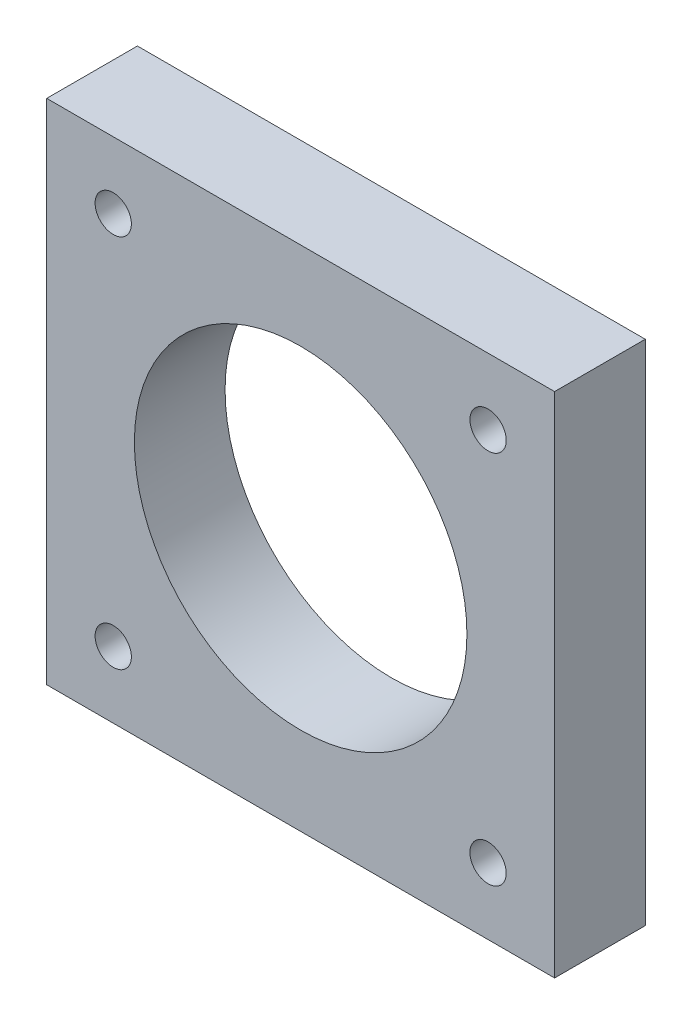
ISO-10303-21;
HEADER;
FILE_DESCRIPTION(('STEP AP214'),'2;1');
FILE_NAME('part.step','',(''),(''),'','','');
FILE_SCHEMA(('AUTOMOTIVE_DESIGN { 1 0 10303 214 1 1 1 1 }'));
ENDSEC;
DATA;
#1=APPLICATION_CONTEXT('core data for automotive mechanical design processes');
#2=APPLICATION_PROTOCOL_DEFINITION('international standard','automotive_design',2000,#1);
#3=PRODUCT_CONTEXT('',#1,'mechanical');
#4=PRODUCT('Part','Part','',(#3));
#5=PRODUCT_RELATED_PRODUCT_CATEGORY('part','',(#4));
#6=PRODUCT_DEFINITION_FORMATION('','',#4);
#7=PRODUCT_DEFINITION_CONTEXT('part definition',#1,'design');
#8=PRODUCT_DEFINITION('design','',#6,#7);
#9=PRODUCT_DEFINITION_SHAPE('','',#8);
#10=(LENGTH_UNIT() NAMED_UNIT(*) SI_UNIT(.MILLI.,.METRE.));
#11=(NAMED_UNIT(*) PLANE_ANGLE_UNIT() SI_UNIT($,.RADIAN.));
#12=(NAMED_UNIT(*) SI_UNIT($,.STERADIAN.) SOLID_ANGLE_UNIT());
#13=UNCERTAINTY_MEASURE_WITH_UNIT(LENGTH_MEASURE(1.E-05),#10,'distance_accuracy_value','');
#14=(GEOMETRIC_REPRESENTATION_CONTEXT(3) GLOBAL_UNCERTAINTY_ASSIGNED_CONTEXT((#13)) GLOBAL_UNIT_ASSIGNED_CONTEXT((#10,
#11,#12)) REPRESENTATION_CONTEXT('',''));
#15=CARTESIAN_POINT('',(0.,0.,0.));
#16=DIRECTION('',(0.,0.,1.));
#17=DIRECTION('',(1.,0.,0.));
#18=AXIS2_PLACEMENT_3D('',#15,#16,#17);
#19=CARTESIAN_POINT('',(0.,0.,7.5));
#20=DIRECTION('',(0.,0.,-1.));
#21=DIRECTION('',(-1.,0.,0.));
#22=AXIS2_PLACEMENT_3D('',#19,#20,#21);
#23=PLANE('',#22);
#24=CARTESIAN_POINT('',(5.5,36.5,7.5));
#25=DIRECTION('',(0.,0.,1.));
#26=DIRECTION('',(1.,0.,0.));
#27=AXIS2_PLACEMENT_3D('',#24,#25,#26);
#28=CIRCLE('',#27,1.5);
#29=CARTESIAN_POINT('',(7.,36.5,7.5));
#30=VERTEX_POINT('',#29);
#31=EDGE_CURVE('E129',#30,#30,#28,.T.);
#32=ORIENTED_EDGE('',*,*,#31,.F.);
#33=EDGE_LOOP('',(#32));
#34=FACE_BOUND('',#33,.T.);
#35=CARTESIAN_POINT('',(36.5,5.50000000000001,7.5));
#36=DIRECTION('',(0.,0.,1.));
#37=DIRECTION('',(1.,0.,0.));
#38=AXIS2_PLACEMENT_3D('',#35,#36,#37);
#39=CIRCLE('',#38,1.5);
#40=CARTESIAN_POINT('',(38.,5.50000000000001,7.5));
#41=VERTEX_POINT('',#40);
#42=EDGE_CURVE('E117',#41,#41,#39,.T.);
#43=ORIENTED_EDGE('',*,*,#42,.F.);
#44=EDGE_LOOP('',(#43));
#45=FACE_BOUND('',#44,.T.);
#46=DIRECTION('',(0.,-1.,0.));
#47=VECTOR('',#46,1.);
#48=CARTESIAN_POINT('',(0.,0.,7.5));
#49=LINE('',#48,#47);
#50=CARTESIAN_POINT('',(0.,42.,7.5));
#51=VERTEX_POINT('',#50);
#52=CARTESIAN_POINT('',(0.,0.,7.5));
#53=VERTEX_POINT('',#52);
#54=EDGE_CURVE('E87',#51,#53,#49,.T.);
#55=ORIENTED_EDGE('',*,*,#54,.T.);
#56=DIRECTION('',(1.,0.,0.));
#57=VECTOR('',#56,1.);
#58=CARTESIAN_POINT('',(0.,0.,7.5));
#59=LINE('',#58,#57);
#60=CARTESIAN_POINT('',(42.,0.,7.5));
#61=VERTEX_POINT('',#60);
#62=EDGE_CURVE('E82',#53,#61,#59,.T.);
#63=ORIENTED_EDGE('',*,*,#62,.T.);
#64=DIRECTION('',(0.,1.,0.));
#65=VECTOR('',#64,1.);
#66=CARTESIAN_POINT('',(42.,0.,7.5));
#67=LINE('',#66,#65);
#68=CARTESIAN_POINT('',(42.,42.,7.5));
#69=VERTEX_POINT('',#68);
#70=EDGE_CURVE('E85',#61,#69,#67,.T.);
#71=ORIENTED_EDGE('',*,*,#70,.T.);
#72=DIRECTION('',(-1.,0.,0.));
#73=VECTOR('',#72,1.);
#74=CARTESIAN_POINT('',(0.,42.,7.5));
#75=LINE('',#74,#73);
#76=EDGE_CURVE('E52',#69,#51,#75,.T.);
#77=ORIENTED_EDGE('',*,*,#76,.T.);
#78=EDGE_LOOP('',(#55,#63,#71,#77));
#79=FACE_BOUND('',#78,.T.);
#80=CARTESIAN_POINT('',(5.5,5.50000000000001,7.5));
#81=DIRECTION('',(0.,0.,1.));
#82=DIRECTION('',(1.,0.,0.));
#83=AXIS2_PLACEMENT_3D('',#80,#81,#82);
#84=CIRCLE('',#83,1.5);
#85=CARTESIAN_POINT('',(7.,5.50000000000001,7.5));
#86=VERTEX_POINT('',#85);
#87=EDGE_CURVE('E102',#86,#86,#84,.T.);
#88=ORIENTED_EDGE('',*,*,#87,.F.);
#89=EDGE_LOOP('',(#88));
#90=FACE_BOUND('',#89,.T.);
#91=CARTESIAN_POINT('',(36.5,36.5,7.5));
#92=DIRECTION('',(0.,0.,1.));
#93=DIRECTION('',(1.,0.,0.));
#94=AXIS2_PLACEMENT_3D('',#91,#92,#93);
#95=CIRCLE('',#94,1.5);
#96=CARTESIAN_POINT('',(38.,36.5,7.5));
#97=VERTEX_POINT('',#96);
#98=EDGE_CURVE('E123',#97,#97,#95,.T.);
#99=ORIENTED_EDGE('',*,*,#98,.F.);
#100=EDGE_LOOP('',(#99));
#101=FACE_BOUND('',#100,.T.);
#102=CARTESIAN_POINT('',(21.,21.,7.5));
#103=DIRECTION('',(0.,0.,1.));
#104=DIRECTION('',(1.,0.,0.));
#105=AXIS2_PLACEMENT_3D('',#102,#103,#104);
#106=CIRCLE('',#105,13.75);
#107=CARTESIAN_POINT('',(34.75,21.,7.5));
#108=VERTEX_POINT('',#107);
#109=EDGE_CURVE('E135',#108,#108,#106,.T.);
#110=ORIENTED_EDGE('',*,*,#109,.F.);
#111=EDGE_LOOP('',(#110));
#112=FACE_BOUND('',#111,.T.);
#113=ADVANCED_FACE('F35',(#34,#45,#79,#90,#101,#112),#23,.F.);
#114=CARTESIAN_POINT('',(0.,0.,0.));
#115=DIRECTION('',(0.,0.,-1.));
#116=DIRECTION('',(-1.,0.,0.));
#117=AXIS2_PLACEMENT_3D('',#114,#115,#116);
#118=PLANE('',#117);
#119=CARTESIAN_POINT('',(5.5,36.5,0.));
#120=DIRECTION('',(0.,0.,1.));
#121=DIRECTION('',(1.,0.,0.));
#122=AXIS2_PLACEMENT_3D('',#119,#120,#121);
#123=CIRCLE('',#122,1.5);
#124=CARTESIAN_POINT('',(7.,36.5,0.));
#125=VERTEX_POINT('',#124);
#126=EDGE_CURVE('E132',#125,#125,#123,.T.);
#127=ORIENTED_EDGE('',*,*,#126,.T.);
#128=EDGE_LOOP('',(#127));
#129=FACE_BOUND('',#128,.T.);
#130=CARTESIAN_POINT('',(36.5,5.50000000000001,0.));
#131=DIRECTION('',(0.,0.,1.));
#132=DIRECTION('',(1.,0.,0.));
#133=AXIS2_PLACEMENT_3D('',#130,#131,#132);
#134=CIRCLE('',#133,1.5);
#135=CARTESIAN_POINT('',(38.,5.50000000000001,0.));
#136=VERTEX_POINT('',#135);
#137=EDGE_CURVE('E120',#136,#136,#134,.T.);
#138=ORIENTED_EDGE('',*,*,#137,.T.);
#139=EDGE_LOOP('',(#138));
#140=FACE_BOUND('',#139,.T.);
#141=DIRECTION('',(0.,-1.,0.));
#142=VECTOR('',#141,1.);
#143=CARTESIAN_POINT('',(0.,0.,0.));
#144=LINE('',#143,#142);
#145=CARTESIAN_POINT('',(0.,42.,0.));
#146=VERTEX_POINT('',#145);
#147=CARTESIAN_POINT('',(0.,0.,0.));
#148=VERTEX_POINT('',#147);
#149=EDGE_CURVE('E99',#146,#148,#144,.T.);
#150=ORIENTED_EDGE('',*,*,#149,.F.);
#151=DIRECTION('',(-1.,0.,0.));
#152=VECTOR('',#151,1.);
#153=CARTESIAN_POINT('',(0.,42.,0.));
#154=LINE('',#153,#152);
#155=CARTESIAN_POINT('',(42.,42.,0.));
#156=VERTEX_POINT('',#155);
#157=EDGE_CURVE('E75',#156,#146,#154,.T.);
#158=ORIENTED_EDGE('',*,*,#157,.F.);
#159=DIRECTION('',(0.,1.,0.));
#160=VECTOR('',#159,1.);
#161=CARTESIAN_POINT('',(42.,0.,0.));
#162=LINE('',#161,#160);
#163=CARTESIAN_POINT('',(42.,0.,0.));
#164=VERTEX_POINT('',#163);
#165=EDGE_CURVE('E69',#164,#156,#162,.T.);
#166=ORIENTED_EDGE('',*,*,#165,.F.);
#167=DIRECTION('',(1.,0.,0.));
#168=VECTOR('',#167,1.);
#169=CARTESIAN_POINT('',(0.,0.,0.));
#170=LINE('',#169,#168);
#171=EDGE_CURVE('E91',#148,#164,#170,.T.);
#172=ORIENTED_EDGE('',*,*,#171,.F.);
#173=EDGE_LOOP('',(#150,#158,#166,#172));
#174=FACE_BOUND('',#173,.T.);
#175=CARTESIAN_POINT('',(5.5,5.50000000000001,0.));
#176=DIRECTION('',(0.,0.,1.));
#177=DIRECTION('',(1.,0.,0.));
#178=AXIS2_PLACEMENT_3D('',#175,#176,#177);
#179=CIRCLE('',#178,1.5);
#180=CARTESIAN_POINT('',(7.,5.50000000000001,0.));
#181=VERTEX_POINT('',#180);
#182=EDGE_CURVE('E114',#181,#181,#179,.T.);
#183=ORIENTED_EDGE('',*,*,#182,.T.);
#184=EDGE_LOOP('',(#183));
#185=FACE_BOUND('',#184,.T.);
#186=CARTESIAN_POINT('',(36.5,36.5,0.));
#187=DIRECTION('',(0.,0.,1.));
#188=DIRECTION('',(1.,0.,0.));
#189=AXIS2_PLACEMENT_3D('',#186,#187,#188);
#190=CIRCLE('',#189,1.5);
#191=CARTESIAN_POINT('',(38.,36.5,0.));
#192=VERTEX_POINT('',#191);
#193=EDGE_CURVE('E126',#192,#192,#190,.T.);
#194=ORIENTED_EDGE('',*,*,#193,.T.);
#195=EDGE_LOOP('',(#194));
#196=FACE_BOUND('',#195,.T.);
#197=CARTESIAN_POINT('',(21.,21.,0.));
#198=DIRECTION('',(0.,0.,1.));
#199=DIRECTION('',(1.,0.,0.));
#200=AXIS2_PLACEMENT_3D('',#197,#198,#199);
#201=CIRCLE('',#200,13.75);
#202=CARTESIAN_POINT('',(34.75,21.,0.));
#203=VERTEX_POINT('',#202);
#204=EDGE_CURVE('E138',#203,#203,#201,.T.);
#205=ORIENTED_EDGE('',*,*,#204,.T.);
#206=EDGE_LOOP('',(#205));
#207=FACE_BOUND('',#206,.T.);
#208=ADVANCED_FACE('F110',(#129,#140,#174,#185,#196,#207),#118,.T.);
#209=CARTESIAN_POINT('',(0.,0.,7.5));
#210=DIRECTION('',(1.,0.,0.));
#211=DIRECTION('',(0.,0.,-1.));
#212=AXIS2_PLACEMENT_3D('',#209,#210,#211);
#213=PLANE('',#212);
#214=ORIENTED_EDGE('',*,*,#149,.T.);
#215=DIRECTION('',(0.,0.,-1.));
#216=VECTOR('',#215,1.);
#217=CARTESIAN_POINT('',(0.,0.,7.5));
#218=LINE('',#217,#216);
#219=EDGE_CURVE('E11',#53,#148,#218,.T.);
#220=ORIENTED_EDGE('',*,*,#219,.F.);
#221=ORIENTED_EDGE('',*,*,#54,.F.);
#222=DIRECTION('',(0.,0.,-1.));
#223=VECTOR('',#222,1.);
#224=CARTESIAN_POINT('',(0.,42.,7.5));
#225=LINE('',#224,#223);
#226=EDGE_CURVE('E95',#51,#146,#225,.T.);
#227=ORIENTED_EDGE('',*,*,#226,.T.);
#228=EDGE_LOOP('',(#214,#220,#221,#227));
#229=FACE_BOUND('',#228,.T.);
#230=ADVANCED_FACE('F37',(#229),#213,.F.);
#231=CARTESIAN_POINT('',(0.,0.,7.5));
#232=DIRECTION('',(0.,1.,0.));
#233=DIRECTION('',(0.,0.,1.));
#234=AXIS2_PLACEMENT_3D('',#231,#232,#233);
#235=PLANE('',#234);
#236=ORIENTED_EDGE('',*,*,#171,.T.);
#237=DIRECTION('',(0.,0.,-1.));
#238=VECTOR('',#237,1.);
#239=CARTESIAN_POINT('',(42.,0.,7.5));
#240=LINE('',#239,#238);
#241=EDGE_CURVE('E44',#61,#164,#240,.T.);
#242=ORIENTED_EDGE('',*,*,#241,.F.);
#243=ORIENTED_EDGE('',*,*,#62,.F.);
#244=ORIENTED_EDGE('',*,*,#219,.T.);
#245=EDGE_LOOP('',(#236,#242,#243,#244));
#246=FACE_BOUND('',#245,.T.);
#247=ADVANCED_FACE('F90',(#246),#235,.F.);
#248=CARTESIAN_POINT('',(42.,0.,7.5));
#249=DIRECTION('',(-1.,0.,0.));
#250=DIRECTION('',(0.,0.,1.));
#251=AXIS2_PLACEMENT_3D('',#248,#249,#250);
#252=PLANE('',#251);
#253=ORIENTED_EDGE('',*,*,#165,.T.);
#254=DIRECTION('',(0.,0.,-1.));
#255=VECTOR('',#254,1.);
#256=CARTESIAN_POINT('',(42.,42.,7.5));
#257=LINE('',#256,#255);
#258=EDGE_CURVE('E92',#69,#156,#257,.T.);
#259=ORIENTED_EDGE('',*,*,#258,.F.);
#260=ORIENTED_EDGE('',*,*,#70,.F.);
#261=ORIENTED_EDGE('',*,*,#241,.T.);
#262=EDGE_LOOP('',(#253,#259,#260,#261));
#263=FACE_BOUND('',#262,.T.);
#264=ADVANCED_FACE('F93',(#263),#252,.F.);
#265=CARTESIAN_POINT('',(0.,42.,7.5));
#266=DIRECTION('',(0.,-1.,0.));
#267=DIRECTION('',(0.,0.,-1.));
#268=AXIS2_PLACEMENT_3D('',#265,#266,#267);
#269=PLANE('',#268);
#270=ORIENTED_EDGE('',*,*,#157,.T.);
#271=ORIENTED_EDGE('',*,*,#226,.F.);
#272=ORIENTED_EDGE('',*,*,#76,.F.);
#273=ORIENTED_EDGE('',*,*,#258,.T.);
#274=EDGE_LOOP('',(#270,#271,#272,#273));
#275=FACE_BOUND('',#274,.T.);
#276=ADVANCED_FACE('F107',(#275),#269,.F.);
#277=CARTESIAN_POINT('',(5.5,5.50000000000001,7.5));
#278=DIRECTION('',(0.,0.,-1.));
#279=DIRECTION('',(-1.,0.,0.));
#280=AXIS2_PLACEMENT_3D('',#277,#278,#279);
#281=CYLINDRICAL_SURFACE('',#280,1.5);
#282=ORIENTED_EDGE('',*,*,#87,.T.);
#283=EDGE_LOOP('',(#282));
#284=FACE_BOUND('',#283,.T.);
#285=ORIENTED_EDGE('',*,*,#182,.F.);
#286=EDGE_LOOP('',(#285));
#287=FACE_BOUND('',#286,.T.);
#288=ADVANCED_FACE('F158',(#284,#287),#281,.F.);
#289=CARTESIAN_POINT('',(36.5,5.50000000000001,7.5));
#290=DIRECTION('',(0.,0.,-1.));
#291=DIRECTION('',(-1.,0.,0.));
#292=AXIS2_PLACEMENT_3D('',#289,#290,#291);
#293=CYLINDRICAL_SURFACE('',#292,1.5);
#294=ORIENTED_EDGE('',*,*,#42,.T.);
#295=EDGE_LOOP('',(#294));
#296=FACE_BOUND('',#295,.T.);
#297=ORIENTED_EDGE('',*,*,#137,.F.);
#298=EDGE_LOOP('',(#297));
#299=FACE_BOUND('',#298,.T.);
#300=ADVANCED_FACE('F204',(#296,#299),#293,.F.);
#301=CARTESIAN_POINT('',(36.5,36.5,7.5));
#302=DIRECTION('',(0.,0.,-1.));
#303=DIRECTION('',(-1.,0.,0.));
#304=AXIS2_PLACEMENT_3D('',#301,#302,#303);
#305=CYLINDRICAL_SURFACE('',#304,1.5);
#306=ORIENTED_EDGE('',*,*,#98,.T.);
#307=EDGE_LOOP('',(#306));
#308=FACE_BOUND('',#307,.T.);
#309=ORIENTED_EDGE('',*,*,#193,.F.);
#310=EDGE_LOOP('',(#309));
#311=FACE_BOUND('',#310,.T.);
#312=ADVANCED_FACE('F212',(#308,#311),#305,.F.);
#313=CARTESIAN_POINT('',(5.5,36.5,7.5));
#314=DIRECTION('',(0.,0.,-1.));
#315=DIRECTION('',(-1.,0.,0.));
#316=AXIS2_PLACEMENT_3D('',#313,#314,#315);
#317=CYLINDRICAL_SURFACE('',#316,1.5);
#318=ORIENTED_EDGE('',*,*,#31,.T.);
#319=EDGE_LOOP('',(#318));
#320=FACE_BOUND('',#319,.T.);
#321=ORIENTED_EDGE('',*,*,#126,.F.);
#322=EDGE_LOOP('',(#321));
#323=FACE_BOUND('',#322,.T.);
#324=ADVANCED_FACE('F220',(#320,#323),#317,.F.);
#325=CARTESIAN_POINT('',(21.,21.,7.5));
#326=DIRECTION('',(0.,0.,-1.));
#327=DIRECTION('',(-1.,0.,0.));
#328=AXIS2_PLACEMENT_3D('',#325,#326,#327);
#329=CYLINDRICAL_SURFACE('',#328,13.75);
#330=ORIENTED_EDGE('',*,*,#109,.T.);
#331=EDGE_LOOP('',(#330));
#332=FACE_BOUND('',#331,.T.);
#333=ORIENTED_EDGE('',*,*,#204,.F.);
#334=EDGE_LOOP('',(#333));
#335=FACE_BOUND('',#334,.T.);
#336=ADVANCED_FACE('F144',(#332,#335),#329,.F.);
#337=CLOSED_SHELL('',(#113,#208,#230,#247,#264,#276,#288,#300,#312,#324,#336));
#338=MANIFOLD_SOLID_BREP('B2',#337);
#339=ADVANCED_BREP_SHAPE_REPRESENTATION('',(#18,#338),#14);
#340=SHAPE_DEFINITION_REPRESENTATION(#9,#339);
ENDSEC;
END-ISO-10303-21;
